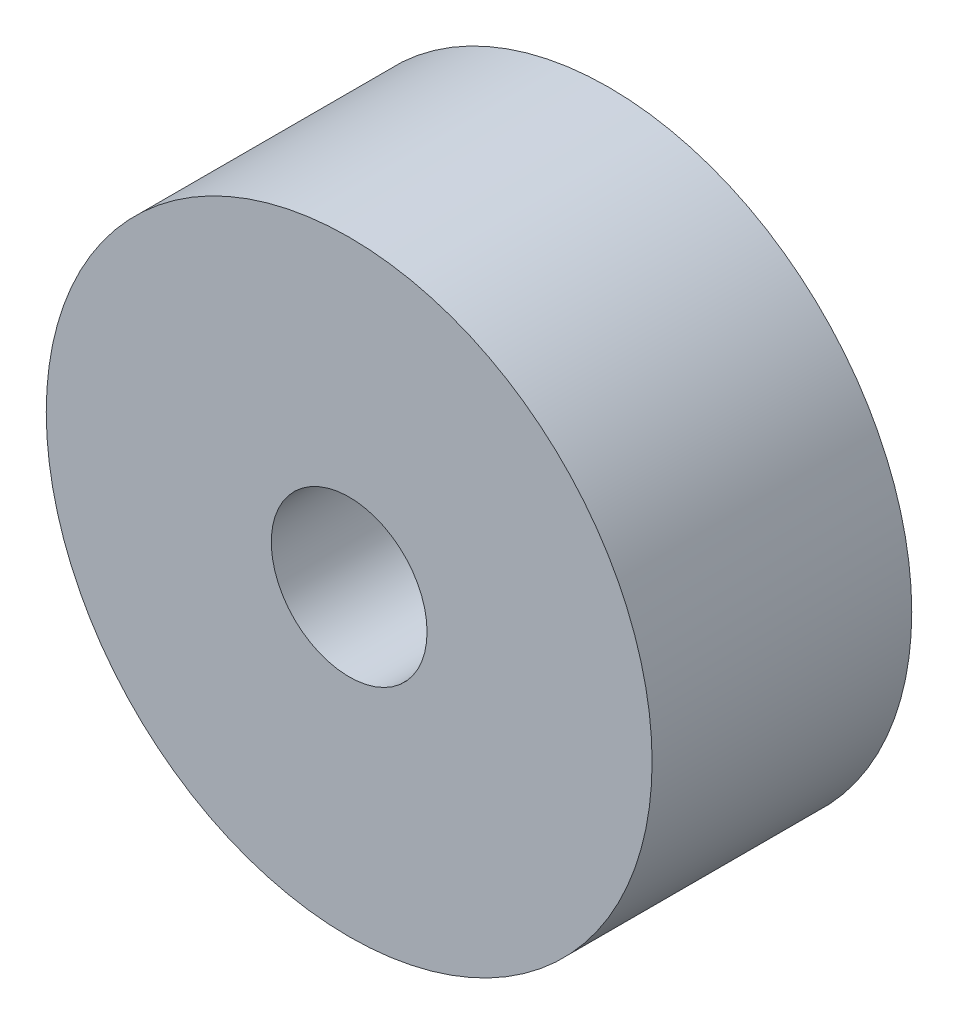
ISO-10303-21;
HEADER;
FILE_DESCRIPTION(('STEP AP214'),'2;1');
FILE_NAME('part.step','',(''),(''),'','','');
FILE_SCHEMA(('AUTOMOTIVE_DESIGN { 1 0 10303 214 1 1 1 1 }'));
ENDSEC;
DATA;
#1=APPLICATION_CONTEXT('core data for automotive mechanical design processes');
#2=APPLICATION_PROTOCOL_DEFINITION('international standard','automotive_design',2000,#1);
#3=PRODUCT_CONTEXT('',#1,'mechanical');
#4=PRODUCT('Part','Part','',(#3));
#5=PRODUCT_RELATED_PRODUCT_CATEGORY('part','',(#4));
#6=PRODUCT_DEFINITION_FORMATION('','',#4);
#7=PRODUCT_DEFINITION_CONTEXT('part definition',#1,'design');
#8=PRODUCT_DEFINITION('design','',#6,#7);
#9=PRODUCT_DEFINITION_SHAPE('','',#8);
#10=(LENGTH_UNIT() NAMED_UNIT(*) SI_UNIT(.MILLI.,.METRE.));
#11=(NAMED_UNIT(*) PLANE_ANGLE_UNIT() SI_UNIT($,.RADIAN.));
#12=(NAMED_UNIT(*) SI_UNIT($,.STERADIAN.) SOLID_ANGLE_UNIT());
#13=UNCERTAINTY_MEASURE_WITH_UNIT(LENGTH_MEASURE(1.E-05),#10,'distance_accuracy_value','');
#14=(GEOMETRIC_REPRESENTATION_CONTEXT(3) GLOBAL_UNCERTAINTY_ASSIGNED_CONTEXT((#13)) GLOBAL_UNIT_ASSIGNED_CONTEXT((#10,
#11,#12)) REPRESENTATION_CONTEXT('',''));
#15=CARTESIAN_POINT('',(0.,0.,0.));
#16=DIRECTION('',(0.,0.,1.));
#17=DIRECTION('',(1.,0.,0.));
#18=AXIS2_PLACEMENT_3D('',#15,#16,#17);
#19=CARTESIAN_POINT('',(0.,0.,300.));
#20=DIRECTION('',(0.,0.,1.));
#21=DIRECTION('',(1.,0.,0.));
#22=AXIS2_PLACEMENT_3D('',#19,#20,#21);
#23=PLANE('',#22);
#24=CARTESIAN_POINT('',(0.,0.,300.));
#25=DIRECTION('',(0.,0.,1.));
#26=DIRECTION('',(1.,0.,0.));
#27=AXIS2_PLACEMENT_3D('',#24,#25,#26);
#28=CIRCLE('',#27,350.);
#29=CARTESIAN_POINT('',(350.,0.,300.));
#30=VERTEX_POINT('',#29);
#31=EDGE_CURVE('E10',#30,#30,#28,.T.);
#32=ORIENTED_EDGE('',*,*,#31,.T.);
#33=EDGE_LOOP('',(#32));
#34=FACE_BOUND('',#33,.T.);
#35=CARTESIAN_POINT('',(0.,0.,300.));
#36=DIRECTION('',(0.,0.,1.));
#37=DIRECTION('',(1.,0.,0.));
#38=AXIS2_PLACEMENT_3D('',#35,#36,#37);
#39=CIRCLE('',#38,90.);
#40=CARTESIAN_POINT('',(90.,0.,300.));
#41=VERTEX_POINT('',#40);
#42=EDGE_CURVE('E50',#41,#41,#39,.T.);
#43=ORIENTED_EDGE('',*,*,#42,.F.);
#44=EDGE_LOOP('',(#43));
#45=FACE_BOUND('',#44,.T.);
#46=ADVANCED_FACE('F37',(#34,#45),#23,.T.);
#47=CARTESIAN_POINT('',(0.,0.,0.));
#48=DIRECTION('',(0.,0.,1.));
#49=DIRECTION('',(1.,0.,0.));
#50=AXIS2_PLACEMENT_3D('',#47,#48,#49);
#51=PLANE('',#50);
#52=CARTESIAN_POINT('',(0.,0.,0.));
#53=DIRECTION('',(0.,0.,1.));
#54=DIRECTION('',(1.,0.,0.));
#55=AXIS2_PLACEMENT_3D('',#52,#53,#54);
#56=CIRCLE('',#55,350.);
#57=CARTESIAN_POINT('',(350.,0.,0.));
#58=VERTEX_POINT('',#57);
#59=EDGE_CURVE('E41',#58,#58,#56,.T.);
#60=ORIENTED_EDGE('',*,*,#59,.F.);
#61=EDGE_LOOP('',(#60));
#62=FACE_BOUND('',#61,.T.);
#63=CARTESIAN_POINT('',(0.,0.,0.));
#64=DIRECTION('',(0.,0.,1.));
#65=DIRECTION('',(1.,0.,0.));
#66=AXIS2_PLACEMENT_3D('',#63,#64,#65);
#67=CIRCLE('',#66,90.);
#68=CARTESIAN_POINT('',(90.,0.,0.));
#69=VERTEX_POINT('',#68);
#70=EDGE_CURVE('E52',#69,#69,#67,.T.);
#71=ORIENTED_EDGE('',*,*,#70,.T.);
#72=EDGE_LOOP('',(#71));
#73=FACE_BOUND('',#72,.T.);
#74=ADVANCED_FACE('F64',(#62,#73),#51,.F.);
#75=CARTESIAN_POINT('',(0.,0.,300.));
#76=DIRECTION('',(0.,0.,-1.));
#77=DIRECTION('',(-1.,0.,0.));
#78=AXIS2_PLACEMENT_3D('',#75,#76,#77);
#79=CYLINDRICAL_SURFACE('',#78,350.);
#80=ORIENTED_EDGE('',*,*,#31,.F.);
#81=EDGE_LOOP('',(#80));
#82=FACE_BOUND('',#81,.T.);
#83=ORIENTED_EDGE('',*,*,#59,.T.);
#84=EDGE_LOOP('',(#83));
#85=FACE_BOUND('',#84,.T.);
#86=ADVANCED_FACE('F39',(#82,#85),#79,.T.);
#87=CARTESIAN_POINT('',(0.,0.,300.));
#88=DIRECTION('',(0.,0.,-1.));
#89=DIRECTION('',(-1.,0.,0.));
#90=AXIS2_PLACEMENT_3D('',#87,#88,#89);
#91=CYLINDRICAL_SURFACE('',#90,90.);
#92=ORIENTED_EDGE('',*,*,#42,.T.);
#93=EDGE_LOOP('',(#92));
#94=FACE_BOUND('',#93,.T.);
#95=ORIENTED_EDGE('',*,*,#70,.F.);
#96=EDGE_LOOP('',(#95));
#97=FACE_BOUND('',#96,.T.);
#98=ADVANCED_FACE('F60',(#94,#97),#91,.F.);
#99=CLOSED_SHELL('',(#46,#74,#86,#98));
#100=MANIFOLD_SOLID_BREP('B2',#99);
#101=ADVANCED_BREP_SHAPE_REPRESENTATION('',(#18,#100),#14);
#102=SHAPE_DEFINITION_REPRESENTATION(#9,#101);
ENDSEC;
END-ISO-10303-21;
